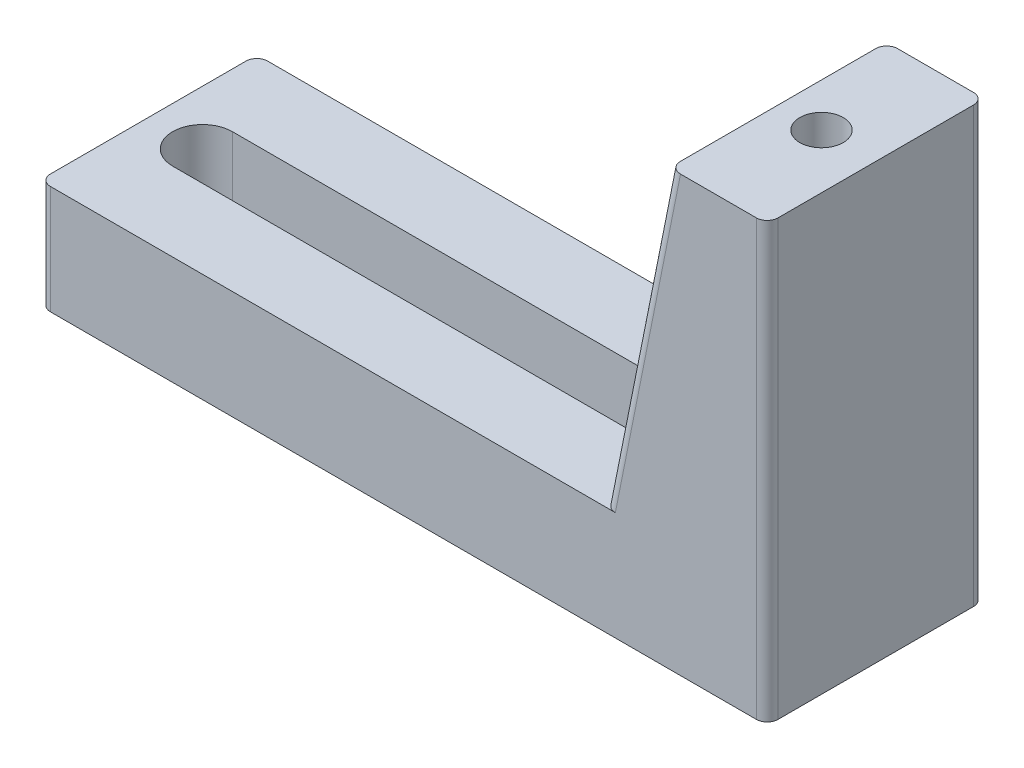
ISO-10303-21;
HEADER;
FILE_DESCRIPTION(('STEP AP214'),'2;1');
FILE_NAME('part.step','',(''),(''),'','','');
FILE_SCHEMA(('AUTOMOTIVE_DESIGN { 1 0 10303 214 1 1 1 1 }'));
ENDSEC;
DATA;
#1=APPLICATION_CONTEXT('core data for automotive mechanical design processes');
#2=APPLICATION_PROTOCOL_DEFINITION('international standard','automotive_design',2000,#1);
#3=PRODUCT_CONTEXT('',#1,'mechanical');
#4=PRODUCT('Part','Part','',(#3));
#5=PRODUCT_RELATED_PRODUCT_CATEGORY('part','',(#4));
#6=PRODUCT_DEFINITION_FORMATION('','',#4);
#7=PRODUCT_DEFINITION_CONTEXT('part definition',#1,'design');
#8=PRODUCT_DEFINITION('design','',#6,#7);
#9=PRODUCT_DEFINITION_SHAPE('','',#8);
#10=(LENGTH_UNIT() NAMED_UNIT(*) SI_UNIT(.MILLI.,.METRE.));
#11=(NAMED_UNIT(*) PLANE_ANGLE_UNIT() SI_UNIT($,.RADIAN.));
#12=(NAMED_UNIT(*) SI_UNIT($,.STERADIAN.) SOLID_ANGLE_UNIT());
#13=UNCERTAINTY_MEASURE_WITH_UNIT(LENGTH_MEASURE(1.E-05),#10,'distance_accuracy_value','');
#14=(GEOMETRIC_REPRESENTATION_CONTEXT(3) GLOBAL_UNCERTAINTY_ASSIGNED_CONTEXT((#13)) GLOBAL_UNIT_ASSIGNED_CONTEXT((#10,
#11,#12)) REPRESENTATION_CONTEXT('',''));
#15=CARTESIAN_POINT('',(0.,0.,0.));
#16=DIRECTION('',(0.,0.,1.));
#17=DIRECTION('',(1.,0.,0.));
#18=AXIS2_PLACEMENT_3D('',#15,#16,#17);
#19=CARTESIAN_POINT('',(55.,-10.,10.));
#20=DIRECTION('',(0.,1.,0.));
#21=DIRECTION('',(0.,0.,1.));
#22=AXIS2_PLACEMENT_3D('',#19,#20,#21);
#23=CYLINDRICAL_SURFACE('',#22,2.);
#24=CARTESIAN_POINT('',(55.,30.,10.));
#25=DIRECTION('',(0.,1.,0.));
#26=DIRECTION('',(0.,0.,1.));
#27=AXIS2_PLACEMENT_3D('',#24,#25,#26);
#28=CIRCLE('',#27,2.);
#29=CARTESIAN_POINT('',(55.,30.,12.));
#30=VERTEX_POINT('',#29);
#31=EDGE_CURVE('E186',#30,#30,#28,.T.);
#32=ORIENTED_EDGE('',*,*,#31,.T.);
#33=EDGE_LOOP('',(#32));
#34=FACE_BOUND('',#33,.T.);
#35=CARTESIAN_POINT('',(55.,25.,10.));
#36=DIRECTION('',(0.,-1.,0.));
#37=DIRECTION('',(1.,0.,0.));
#38=AXIS2_PLACEMENT_3D('',#35,#36,#37);
#39=CIRCLE('',#38,2.);
#40=CARTESIAN_POINT('',(57.,25.,10.));
#41=VERTEX_POINT('',#40);
#42=EDGE_CURVE('E221',#41,#41,#39,.F.);
#43=ORIENTED_EDGE('',*,*,#42,.F.);
#44=EDGE_LOOP('',(#43));
#45=FACE_BOUND('',#44,.T.);
#46=ADVANCED_FACE('F33',(#34,#45),#23,.F.);
#47=CARTESIAN_POINT('',(60.,-9.99999999999999,20.));
#48=DIRECTION('',(0.,1.,0.));
#49=DIRECTION('',(-1.,0.,0.));
#50=AXIS2_PLACEMENT_3D('',#47,#48,#49);
#51=PLANE('',#50);
#52=CARTESIAN_POINT('',(40.,-10.,10.));
#53=DIRECTION('',(0.,1.,0.));
#54=DIRECTION('',(0.,0.,1.));
#55=AXIS2_PLACEMENT_3D('',#52,#53,#54);
#56=CIRCLE('',#55,2.75);
#57=CARTESIAN_POINT('',(40.,-9.99999999999999,12.75));
#58=VERTEX_POINT('',#57);
#59=CARTESIAN_POINT('',(40.,-10.,7.25));
#60=VERTEX_POINT('',#59);
#61=EDGE_CURVE('E48',#58,#60,#56,.T.);
#62=ORIENTED_EDGE('',*,*,#61,.T.);
#63=DIRECTION('',(-1.,0.,0.));
#64=VECTOR('',#63,1.);
#65=CARTESIAN_POINT('',(-2.,-10.,7.25));
#66=LINE('',#65,#64);
#67=CARTESIAN_POINT('',(-2.,-10.,7.25));
#68=VERTEX_POINT('',#67);
#69=EDGE_CURVE('E160',#60,#68,#66,.T.);
#70=ORIENTED_EDGE('',*,*,#69,.T.);
#71=CARTESIAN_POINT('',(-2.,-10.,10.));
#72=DIRECTION('',(0.,1.,0.));
#73=DIRECTION('',(0.,0.,1.));
#74=AXIS2_PLACEMENT_3D('',#71,#72,#73);
#75=CIRCLE('',#74,2.75);
#76=CARTESIAN_POINT('',(-2.,-10.,12.75));
#77=VERTEX_POINT('',#76);
#78=EDGE_CURVE('E155',#68,#77,#75,.T.);
#79=ORIENTED_EDGE('',*,*,#78,.T.);
#80=DIRECTION('',(1.,0.,0.));
#81=VECTOR('',#80,1.);
#82=CARTESIAN_POINT('',(-2.,-10.,12.75));
#83=LINE('',#82,#81);
#84=EDGE_CURVE('E148',#77,#58,#83,.T.);
#85=ORIENTED_EDGE('',*,*,#84,.T.);
#86=EDGE_LOOP('',(#62,#70,#79,#85));
#87=FACE_BOUND('',#86,.T.);
#88=DIRECTION('',(1.,0.,0.));
#89=VECTOR('',#88,1.);
#90=CARTESIAN_POINT('',(60.,-9.99999999999999,0.));
#91=LINE('',#90,#89);
#92=CARTESIAN_POINT('',(-6.00000000000001,-10.,0.));
#93=VERTEX_POINT('',#92);
#94=CARTESIAN_POINT('',(59.,-9.99999999999999,0.));
#95=VERTEX_POINT('',#94);
#96=EDGE_CURVE('E191',#93,#95,#91,.T.);
#97=ORIENTED_EDGE('',*,*,#96,.T.);
#98=CARTESIAN_POINT('',(59.,-9.99999999999999,1.));
#99=DIRECTION('',(0.,1.,0.));
#100=DIRECTION('',(-1.,0.,0.));
#101=AXIS2_PLACEMENT_3D('',#98,#99,#100);
#102=CIRCLE('',#101,1.);
#103=CARTESIAN_POINT('',(60.,-9.99999999999999,1.));
#104=VERTEX_POINT('',#103);
#105=EDGE_CURVE('E263',#95,#104,#102,.F.);
#106=ORIENTED_EDGE('',*,*,#105,.T.);
#107=DIRECTION('',(0.,0.,-1.));
#108=VECTOR('',#107,1.);
#109=CARTESIAN_POINT('',(60.,-9.99999999999999,20.));
#110=LINE('',#109,#108);
#111=CARTESIAN_POINT('',(60.,-9.99999999999999,19.));
#112=VERTEX_POINT('',#111);
#113=EDGE_CURVE('E218',#112,#104,#110,.T.);
#114=ORIENTED_EDGE('',*,*,#113,.F.);
#115=CARTESIAN_POINT('',(59.,-9.99999999999999,19.));
#116=DIRECTION('',(0.,1.,0.));
#117=DIRECTION('',(-1.,0.,0.));
#118=AXIS2_PLACEMENT_3D('',#115,#116,#117);
#119=CIRCLE('',#118,1.);
#120=CARTESIAN_POINT('',(59.,-9.99999999999999,20.));
#121=VERTEX_POINT('',#120);
#122=EDGE_CURVE('E261',#112,#121,#119,.F.);
#123=ORIENTED_EDGE('',*,*,#122,.T.);
#124=DIRECTION('',(1.,0.,0.));
#125=VECTOR('',#124,1.);
#126=CARTESIAN_POINT('',(60.,-9.99999999999999,20.));
#127=LINE('',#126,#125);
#128=CARTESIAN_POINT('',(-6.00000000000001,-10.,20.));
#129=VERTEX_POINT('',#128);
#130=EDGE_CURVE('E192',#129,#121,#127,.T.);
#131=ORIENTED_EDGE('',*,*,#130,.F.);
#132=CARTESIAN_POINT('',(-6.,-10.,19.));
#133=DIRECTION('',(0.,1.,0.));
#134=DIRECTION('',(-1.,0.,0.));
#135=AXIS2_PLACEMENT_3D('',#132,#133,#134);
#136=CIRCLE('',#135,1.);
#137=CARTESIAN_POINT('',(-7.,-10.,19.));
#138=VERTEX_POINT('',#137);
#139=EDGE_CURVE('E259',#129,#138,#136,.F.);
#140=ORIENTED_EDGE('',*,*,#139,.T.);
#141=DIRECTION('',(0.,0.,-1.));
#142=VECTOR('',#141,1.);
#143=CARTESIAN_POINT('',(-7.,-10.,0.));
#144=LINE('',#143,#142);
#145=CARTESIAN_POINT('',(-7.,-10.,1.));
#146=VERTEX_POINT('',#145);
#147=EDGE_CURVE('E183',#138,#146,#144,.T.);
#148=ORIENTED_EDGE('',*,*,#147,.T.);
#149=CARTESIAN_POINT('',(-6.,-10.,1.));
#150=DIRECTION('',(0.,1.,0.));
#151=DIRECTION('',(-1.,0.,0.));
#152=AXIS2_PLACEMENT_3D('',#149,#150,#151);
#153=CIRCLE('',#152,1.);
#154=EDGE_CURVE('E257',#146,#93,#153,.F.);
#155=ORIENTED_EDGE('',*,*,#154,.T.);
#156=EDGE_LOOP('',(#97,#106,#114,#123,#131,#140,#148,#155));
#157=FACE_BOUND('',#156,.T.);
#158=ADVANCED_FACE('F162',(#87,#157),#51,.F.);
#159=CARTESIAN_POINT('',(60.,30.,20.));
#160=DIRECTION('',(-1.,0.,0.));
#161=DIRECTION('',(0.,-1.,0.));
#162=AXIS2_PLACEMENT_3D('',#159,#160,#161);
#163=PLANE('',#162);
#164=ORIENTED_EDGE('',*,*,#113,.T.);
#165=DIRECTION('',(0.,1.,0.));
#166=VECTOR('',#165,1.);
#167=CARTESIAN_POINT('',(60.,30.,1.));
#168=LINE('',#167,#166);
#169=CARTESIAN_POINT('',(60.,30.,1.));
#170=VERTEX_POINT('',#169);
#171=EDGE_CURVE('E254',#104,#170,#168,.T.);
#172=ORIENTED_EDGE('',*,*,#171,.T.);
#173=DIRECTION('',(0.,0.,-1.));
#174=VECTOR('',#173,1.);
#175=CARTESIAN_POINT('',(60.,30.,20.));
#176=LINE('',#175,#174);
#177=CARTESIAN_POINT('',(60.,30.,19.));
#178=VERTEX_POINT('',#177);
#179=EDGE_CURVE('E215',#178,#170,#176,.T.);
#180=ORIENTED_EDGE('',*,*,#179,.F.);
#181=DIRECTION('',(0.,1.,0.));
#182=VECTOR('',#181,1.);
#183=CARTESIAN_POINT('',(60.,30.,19.));
#184=LINE('',#183,#182);
#185=EDGE_CURVE('E252',#178,#112,#184,.F.);
#186=ORIENTED_EDGE('',*,*,#185,.T.);
#187=EDGE_LOOP('',(#164,#172,#180,#186));
#188=FACE_BOUND('',#187,.T.);
#189=ADVANCED_FACE('F295',(#188),#163,.F.);
#190=CARTESIAN_POINT('',(51.,30.,20.));
#191=DIRECTION('',(0.,-1.,0.));
#192=DIRECTION('',(1.,0.,0.));
#193=AXIS2_PLACEMENT_3D('',#190,#191,#192);
#194=PLANE('',#193);
#195=ORIENTED_EDGE('',*,*,#31,.F.);
#196=EDGE_LOOP('',(#195));
#197=FACE_BOUND('',#196,.T.);
#198=DIRECTION('',(-1.,0.,0.));
#199=VECTOR('',#198,1.);
#200=CARTESIAN_POINT('',(51.,30.,0.));
#201=LINE('',#200,#199);
#202=CARTESIAN_POINT('',(59.,30.,0.));
#203=VERTEX_POINT('',#202);
#204=CARTESIAN_POINT('',(52.0198039027186,30.,0.));
#205=VERTEX_POINT('',#204);
#206=EDGE_CURVE('E205',#203,#205,#201,.T.);
#207=ORIENTED_EDGE('',*,*,#206,.T.);
#208=CARTESIAN_POINT('',(52.0198039027186,30.,1.));
#209=DIRECTION('',(0.,-1.,0.));
#210=DIRECTION('',(1.,0.,0.));
#211=AXIS2_PLACEMENT_3D('',#208,#209,#210);
#212=ELLIPSE('',#211,1.01980390271856,1.);
#213=CARTESIAN_POINT('',(51.,30.,1.));
#214=VERTEX_POINT('',#213);
#215=EDGE_CURVE('E242',#205,#214,#212,.F.);
#216=ORIENTED_EDGE('',*,*,#215,.T.);
#217=DIRECTION('',(0.,0.,-1.));
#218=VECTOR('',#217,1.);
#219=CARTESIAN_POINT('',(51.,30.,20.));
#220=LINE('',#219,#218);
#221=CARTESIAN_POINT('',(51.,30.,19.));
#222=VERTEX_POINT('',#221);
#223=EDGE_CURVE('E212',#222,#214,#220,.T.);
#224=ORIENTED_EDGE('',*,*,#223,.F.);
#225=CARTESIAN_POINT('',(52.0198039027185,30.,19.));
#226=DIRECTION('',(0.,-1.,0.));
#227=DIRECTION('',(-1.,0.,0.));
#228=AXIS2_PLACEMENT_3D('',#225,#226,#227);
#229=ELLIPSE('',#228,1.01980390271856,1.);
#230=CARTESIAN_POINT('',(52.0198039027185,30.,20.));
#231=VERTEX_POINT('',#230);
#232=EDGE_CURVE('E240',#222,#231,#229,.F.);
#233=ORIENTED_EDGE('',*,*,#232,.T.);
#234=DIRECTION('',(-1.,0.,0.));
#235=VECTOR('',#234,1.);
#236=CARTESIAN_POINT('',(51.,30.,20.));
#237=LINE('',#236,#235);
#238=CARTESIAN_POINT('',(59.,30.,20.));
#239=VERTEX_POINT('',#238);
#240=EDGE_CURVE('E195',#239,#231,#237,.T.);
#241=ORIENTED_EDGE('',*,*,#240,.F.);
#242=CARTESIAN_POINT('',(59.,30.,19.));
#243=DIRECTION('',(0.,-1.,0.));
#244=DIRECTION('',(1.,0.,0.));
#245=AXIS2_PLACEMENT_3D('',#242,#243,#244);
#246=CIRCLE('',#245,1.);
#247=EDGE_CURVE('E236',#239,#178,#246,.F.);
#248=ORIENTED_EDGE('',*,*,#247,.T.);
#249=ORIENTED_EDGE('',*,*,#179,.T.);
#250=CARTESIAN_POINT('',(59.,30.,1.));
#251=DIRECTION('',(0.,-1.,0.));
#252=DIRECTION('',(1.,0.,0.));
#253=AXIS2_PLACEMENT_3D('',#250,#251,#252);
#254=CIRCLE('',#253,1.);
#255=EDGE_CURVE('E238',#170,#203,#254,.F.);
#256=ORIENTED_EDGE('',*,*,#255,.T.);
#257=EDGE_LOOP('',(#207,#216,#224,#233,#241,#248,#249,#256));
#258=FACE_BOUND('',#257,.T.);
#259=ADVANCED_FACE('F287',(#197,#258),#194,.F.);
#260=CARTESIAN_POINT('',(45.,0.,20.));
#261=DIRECTION('',(0.98058067569092,-0.196116135138184,0.));
#262=DIRECTION('',(0.196116135138184,0.98058067569092,0.));
#263=AXIS2_PLACEMENT_3D('',#260,#261,#262);
#264=PLANE('',#263);
#265=ORIENTED_EDGE('',*,*,#223,.T.);
#266=DIRECTION('',(-0.196116135138184,-0.98058067569092,0.));
#267=VECTOR('',#266,1.);
#268=CARTESIAN_POINT('',(45.,0.,1.));
#269=LINE('',#268,#267);
#270=CARTESIAN_POINT('',(45.,0.,1.));
#271=VERTEX_POINT('',#270);
#272=EDGE_CURVE('E226',#214,#271,#269,.T.);
#273=ORIENTED_EDGE('',*,*,#272,.T.);
#274=DIRECTION('',(0.,0.,-1.));
#275=VECTOR('',#274,1.);
#276=CARTESIAN_POINT('',(45.,0.,20.));
#277=LINE('',#276,#275);
#278=CARTESIAN_POINT('',(45.,0.,19.));
#279=VERTEX_POINT('',#278);
#280=EDGE_CURVE('E202',#279,#271,#277,.T.);
#281=ORIENTED_EDGE('',*,*,#280,.F.);
#282=DIRECTION('',(-0.196116135138184,-0.98058067569092,0.));
#283=VECTOR('',#282,1.);
#284=CARTESIAN_POINT('',(45.,0.,19.));
#285=LINE('',#284,#283);
#286=EDGE_CURVE('E224',#279,#222,#285,.F.);
#287=ORIENTED_EDGE('',*,*,#286,.T.);
#288=EDGE_LOOP('',(#265,#273,#281,#287));
#289=FACE_BOUND('',#288,.T.);
#290=ADVANCED_FACE('F352',(#289),#264,.F.);
#291=CARTESIAN_POINT('',(0.,0.,20.));
#292=DIRECTION('',(0.,-1.,0.));
#293=DIRECTION('',(0.,0.,-1.));
#294=AXIS2_PLACEMENT_3D('',#291,#292,#293);
#295=PLANE('',#294);
#296=DIRECTION('',(1.,0.,0.));
#297=VECTOR('',#296,1.);
#298=CARTESIAN_POINT('',(-2.,0.,12.75));
#299=LINE('',#298,#297);
#300=CARTESIAN_POINT('',(-2.,0.,12.75));
#301=VERTEX_POINT('',#300);
#302=CARTESIAN_POINT('',(40.,0.,12.75));
#303=VERTEX_POINT('',#302);
#304=EDGE_CURVE('E172',#301,#303,#299,.T.);
#305=ORIENTED_EDGE('',*,*,#304,.F.);
#306=CARTESIAN_POINT('',(-2.,0.,10.));
#307=DIRECTION('',(0.,1.,0.));
#308=DIRECTION('',(0.,0.,1.));
#309=AXIS2_PLACEMENT_3D('',#306,#307,#308);
#310=CIRCLE('',#309,2.75);
#311=CARTESIAN_POINT('',(-2.,0.,7.25));
#312=VERTEX_POINT('',#311);
#313=EDGE_CURVE('E56',#312,#301,#310,.T.);
#314=ORIENTED_EDGE('',*,*,#313,.F.);
#315=DIRECTION('',(-1.,0.,0.));
#316=VECTOR('',#315,1.);
#317=CARTESIAN_POINT('',(-2.,0.,7.25));
#318=LINE('',#317,#316);
#319=CARTESIAN_POINT('',(40.,0.,7.25));
#320=VERTEX_POINT('',#319);
#321=EDGE_CURVE('E164',#320,#312,#318,.T.);
#322=ORIENTED_EDGE('',*,*,#321,.F.);
#323=CARTESIAN_POINT('',(40.,0.,10.));
#324=DIRECTION('',(0.,1.,0.));
#325=DIRECTION('',(0.,0.,1.));
#326=AXIS2_PLACEMENT_3D('',#323,#324,#325);
#327=CIRCLE('',#326,2.75);
#328=EDGE_CURVE('E166',#303,#320,#327,.T.);
#329=ORIENTED_EDGE('',*,*,#328,.F.);
#330=EDGE_LOOP('',(#305,#314,#322,#329));
#331=FACE_BOUND('',#330,.T.);
#332=DIRECTION('',(0.,0.,1.));
#333=VECTOR('',#332,1.);
#334=CARTESIAN_POINT('',(-7.,0.,0.));
#335=LINE('',#334,#333);
#336=CARTESIAN_POINT('',(-7.,0.,1.));
#337=VERTEX_POINT('',#336);
#338=CARTESIAN_POINT('',(-7.,0.,19.));
#339=VERTEX_POINT('',#338);
#340=EDGE_CURVE('E178',#337,#339,#335,.T.);
#341=ORIENTED_EDGE('',*,*,#340,.T.);
#342=CARTESIAN_POINT('',(-6.,0.,19.));
#343=DIRECTION('',(0.,-1.,0.));
#344=DIRECTION('',(0.,0.,-1.));
#345=AXIS2_PLACEMENT_3D('',#342,#343,#344);
#346=CIRCLE('',#345,1.);
#347=CARTESIAN_POINT('',(-6.,0.,20.));
#348=VERTEX_POINT('',#347);
#349=EDGE_CURVE('E272',#339,#348,#346,.F.);
#350=ORIENTED_EDGE('',*,*,#349,.T.);
#351=DIRECTION('',(-1.,0.,0.));
#352=VECTOR('',#351,1.);
#353=CARTESIAN_POINT('',(0.,0.,20.));
#354=LINE('',#353,#352);
#355=CARTESIAN_POINT('',(46.0198039027185,0.,20.));
#356=VERTEX_POINT('',#355);
#357=EDGE_CURVE('E199',#356,#348,#354,.T.);
#358=ORIENTED_EDGE('',*,*,#357,.F.);
#359=CARTESIAN_POINT('',(46.0198039027186,0.,19.));
#360=DIRECTION('',(0.,-1.,0.));
#361=DIRECTION('',(-1.,0.,0.));
#362=AXIS2_PLACEMENT_3D('',#359,#360,#361);
#363=ELLIPSE('',#362,1.01980390271856,1.);
#364=EDGE_CURVE('E11',#356,#279,#363,.T.);
#365=ORIENTED_EDGE('',*,*,#364,.T.);
#366=ORIENTED_EDGE('',*,*,#280,.T.);
#367=CARTESIAN_POINT('',(46.0198039027186,0.,1.));
#368=DIRECTION('',(0.,-1.,0.));
#369=DIRECTION('',(1.,0.,0.));
#370=AXIS2_PLACEMENT_3D('',#367,#368,#369);
#371=ELLIPSE('',#370,1.01980390271856,1.);
#372=CARTESIAN_POINT('',(46.0198039027186,0.,0.));
#373=VERTEX_POINT('',#372);
#374=EDGE_CURVE('E41',#271,#373,#371,.T.);
#375=ORIENTED_EDGE('',*,*,#374,.T.);
#376=DIRECTION('',(-1.,0.,0.));
#377=VECTOR('',#376,1.);
#378=CARTESIAN_POINT('',(0.,0.,0.));
#379=LINE('',#378,#377);
#380=CARTESIAN_POINT('',(-6.,0.,0.));
#381=VERTEX_POINT('',#380);
#382=EDGE_CURVE('E196',#373,#381,#379,.T.);
#383=ORIENTED_EDGE('',*,*,#382,.T.);
#384=CARTESIAN_POINT('',(-6.,0.,1.));
#385=DIRECTION('',(0.,-1.,0.));
#386=DIRECTION('',(0.,0.,-1.));
#387=AXIS2_PLACEMENT_3D('',#384,#385,#386);
#388=CIRCLE('',#387,1.);
#389=EDGE_CURVE('E270',#381,#337,#388,.F.);
#390=ORIENTED_EDGE('',*,*,#389,.T.);
#391=EDGE_LOOP('',(#341,#350,#358,#365,#366,#375,#383,#390));
#392=FACE_BOUND('',#391,.T.);
#393=ADVANCED_FACE('F276',(#331,#392),#295,.F.);
#394=CARTESIAN_POINT('',(0.,0.,20.));
#395=DIRECTION('',(0.,0.,-1.));
#396=DIRECTION('',(-1.,0.,0.));
#397=AXIS2_PLACEMENT_3D('',#394,#395,#396);
#398=PLANE('',#397);
#399=ORIENTED_EDGE('',*,*,#240,.T.);
#400=DIRECTION('',(-0.196116135138184,-0.98058067569092,0.));
#401=VECTOR('',#400,1.);
#402=CARTESIAN_POINT('',(44.2498114449217,-8.84996228898432,20.));
#403=LINE('',#402,#401);
#404=EDGE_CURVE('E249',#231,#356,#403,.T.);
#405=ORIENTED_EDGE('',*,*,#404,.T.);
#406=ORIENTED_EDGE('',*,*,#357,.T.);
#407=DIRECTION('',(0.,1.,0.));
#408=VECTOR('',#407,1.);
#409=CARTESIAN_POINT('',(-6.,-10.,20.));
#410=LINE('',#409,#408);
#411=EDGE_CURVE('E244',#348,#129,#410,.F.);
#412=ORIENTED_EDGE('',*,*,#411,.T.);
#413=ORIENTED_EDGE('',*,*,#130,.T.);
#414=DIRECTION('',(0.,1.,0.));
#415=VECTOR('',#414,1.);
#416=CARTESIAN_POINT('',(59.,0.,20.));
#417=LINE('',#416,#415);
#418=EDGE_CURVE('E246',#121,#239,#417,.T.);
#419=ORIENTED_EDGE('',*,*,#418,.T.);
#420=EDGE_LOOP('',(#399,#405,#406,#412,#413,#419));
#421=FACE_BOUND('',#420,.T.);
#422=ADVANCED_FACE('F305',(#421),#398,.F.);
#423=CARTESIAN_POINT('',(0.,0.,0.));
#424=DIRECTION('',(0.,0.,-1.));
#425=DIRECTION('',(-1.,0.,0.));
#426=AXIS2_PLACEMENT_3D('',#423,#424,#425);
#427=PLANE('',#426);
#428=ORIENTED_EDGE('',*,*,#382,.F.);
#429=DIRECTION('',(-0.196116135138184,-0.98058067569092,0.));
#430=VECTOR('',#429,1.);
#431=CARTESIAN_POINT('',(51.9805806756909,29.8038838648618,0.));
#432=LINE('',#431,#430);
#433=EDGE_CURVE('E234',#373,#205,#432,.F.);
#434=ORIENTED_EDGE('',*,*,#433,.T.);
#435=ORIENTED_EDGE('',*,*,#206,.F.);
#436=DIRECTION('',(0.,1.,0.));
#437=VECTOR('',#436,1.);
#438=CARTESIAN_POINT('',(59.,-9.99999999999999,0.));
#439=LINE('',#438,#437);
#440=EDGE_CURVE('E232',#203,#95,#439,.F.);
#441=ORIENTED_EDGE('',*,*,#440,.T.);
#442=ORIENTED_EDGE('',*,*,#96,.F.);
#443=DIRECTION('',(0.,1.,0.));
#444=VECTOR('',#443,1.);
#445=CARTESIAN_POINT('',(-6.,0.,0.));
#446=LINE('',#445,#444);
#447=EDGE_CURVE('E229',#93,#381,#446,.T.);
#448=ORIENTED_EDGE('',*,*,#447,.T.);
#449=EDGE_LOOP('',(#428,#434,#435,#441,#442,#448));
#450=FACE_BOUND('',#449,.T.);
#451=ADVANCED_FACE('F284',(#450),#427,.T.);
#452=CARTESIAN_POINT('',(55.,25.,10.));
#453=DIRECTION('',(0.,-1.,0.));
#454=DIRECTION('',(1.,0.,0.));
#455=AXIS2_PLACEMENT_3D('',#452,#453,#454);
#456=PLANE('',#455);
#457=ORIENTED_EDGE('',*,*,#42,.T.);
#458=EDGE_LOOP('',(#457));
#459=FACE_BOUND('',#458,.T.);
#460=ADVANCED_FACE('F344',(#459),#456,.F.);
#461=CARTESIAN_POINT('',(-7.,-31.1896201004171,0.));
#462=DIRECTION('',(-1.,0.,0.));
#463=DIRECTION('',(0.,0.,1.));
#464=AXIS2_PLACEMENT_3D('',#461,#462,#463);
#465=PLANE('',#464);
#466=ORIENTED_EDGE('',*,*,#147,.F.);
#467=DIRECTION('',(0.,1.,0.));
#468=VECTOR('',#467,1.);
#469=CARTESIAN_POINT('',(-7.,0.,19.));
#470=LINE('',#469,#468);
#471=EDGE_CURVE('E267',#138,#339,#470,.T.);
#472=ORIENTED_EDGE('',*,*,#471,.T.);
#473=ORIENTED_EDGE('',*,*,#340,.F.);
#474=DIRECTION('',(0.,1.,0.));
#475=VECTOR('',#474,1.);
#476=CARTESIAN_POINT('',(-7.,-31.1896201004171,1.));
#477=LINE('',#476,#475);
#478=EDGE_CURVE('E265',#337,#146,#477,.F.);
#479=ORIENTED_EDGE('',*,*,#478,.T.);
#480=EDGE_LOOP('',(#466,#472,#473,#479));
#481=FACE_BOUND('',#480,.T.);
#482=ADVANCED_FACE('F320',(#481),#465,.T.);
#483=CARTESIAN_POINT('',(45.9805806756909,-0.196116135138184,1.));
#484=DIRECTION('',(0.196116135138184,0.98058067569092,0.));
#485=DIRECTION('',(-0.98058067569092,0.196116135138184,0.));
#486=AXIS2_PLACEMENT_3D('',#483,#484,#485);
#487=CYLINDRICAL_SURFACE('',#486,1.);
#488=ORIENTED_EDGE('',*,*,#215,.F.);
#489=ORIENTED_EDGE('',*,*,#433,.F.);
#490=ORIENTED_EDGE('',*,*,#374,.F.);
#491=ORIENTED_EDGE('',*,*,#272,.F.);
#492=EDGE_LOOP('',(#488,#489,#490,#491));
#493=FACE_BOUND('',#492,.T.);
#494=ADVANCED_FACE('F281',(#493),#487,.T.);
#495=CARTESIAN_POINT('',(44.2498114449217,-8.84996228898432,19.));
#496=DIRECTION('',(-0.196116135138184,-0.98058067569092,0.));
#497=DIRECTION('',(0.98058067569092,-0.196116135138184,0.));
#498=AXIS2_PLACEMENT_3D('',#495,#496,#497);
#499=CYLINDRICAL_SURFACE('',#498,1.);
#500=ORIENTED_EDGE('',*,*,#232,.F.);
#501=ORIENTED_EDGE('',*,*,#286,.F.);
#502=ORIENTED_EDGE('',*,*,#364,.F.);
#503=ORIENTED_EDGE('',*,*,#404,.F.);
#504=EDGE_LOOP('',(#500,#501,#502,#503));
#505=FACE_BOUND('',#504,.T.);
#506=ADVANCED_FACE('F310',(#505),#499,.T.);
#507=CARTESIAN_POINT('',(59.,30.,1.));
#508=DIRECTION('',(0.,-1.,0.));
#509=DIRECTION('',(1.,0.,0.));
#510=AXIS2_PLACEMENT_3D('',#507,#508,#509);
#511=CYLINDRICAL_SURFACE('',#510,1.);
#512=ORIENTED_EDGE('',*,*,#105,.F.);
#513=ORIENTED_EDGE('',*,*,#440,.F.);
#514=ORIENTED_EDGE('',*,*,#255,.F.);
#515=ORIENTED_EDGE('',*,*,#171,.F.);
#516=EDGE_LOOP('',(#512,#513,#514,#515));
#517=FACE_BOUND('',#516,.T.);
#518=ADVANCED_FACE('F293',(#517),#511,.T.);
#519=CARTESIAN_POINT('',(59.,0.,19.));
#520=DIRECTION('',(0.,1.,0.));
#521=DIRECTION('',(-1.,0.,0.));
#522=AXIS2_PLACEMENT_3D('',#519,#520,#521);
#523=CYLINDRICAL_SURFACE('',#522,1.);
#524=ORIENTED_EDGE('',*,*,#122,.F.);
#525=ORIENTED_EDGE('',*,*,#185,.F.);
#526=ORIENTED_EDGE('',*,*,#247,.F.);
#527=ORIENTED_EDGE('',*,*,#418,.F.);
#528=EDGE_LOOP('',(#524,#525,#526,#527));
#529=FACE_BOUND('',#528,.T.);
#530=ADVANCED_FACE('F302',(#529),#523,.T.);
#531=CARTESIAN_POINT('',(-6.,-31.1896201004171,19.));
#532=DIRECTION('',(0.,-1.,0.));
#533=DIRECTION('',(0.,0.,-1.));
#534=AXIS2_PLACEMENT_3D('',#531,#532,#533);
#535=CYLINDRICAL_SURFACE('',#534,1.);
#536=ORIENTED_EDGE('',*,*,#139,.F.);
#537=ORIENTED_EDGE('',*,*,#411,.F.);
#538=ORIENTED_EDGE('',*,*,#349,.F.);
#539=ORIENTED_EDGE('',*,*,#471,.F.);
#540=EDGE_LOOP('',(#536,#537,#538,#539));
#541=FACE_BOUND('',#540,.T.);
#542=ADVANCED_FACE('F315',(#541),#535,.T.);
#543=CARTESIAN_POINT('',(-6.,0.,1.));
#544=DIRECTION('',(0.,1.,0.));
#545=DIRECTION('',(0.,0.,1.));
#546=AXIS2_PLACEMENT_3D('',#543,#544,#545);
#547=CYLINDRICAL_SURFACE('',#546,1.);
#548=ORIENTED_EDGE('',*,*,#154,.F.);
#549=ORIENTED_EDGE('',*,*,#478,.F.);
#550=ORIENTED_EDGE('',*,*,#389,.F.);
#551=ORIENTED_EDGE('',*,*,#447,.F.);
#552=EDGE_LOOP('',(#548,#549,#550,#551));
#553=FACE_BOUND('',#552,.T.);
#554=ADVANCED_FACE('F35',(#553),#547,.T.);
#555=CARTESIAN_POINT('',(-2.,-10.,7.25));
#556=DIRECTION('',(0.,0.,-1.));
#557=DIRECTION('',(-1.,0.,0.));
#558=AXIS2_PLACEMENT_3D('',#555,#556,#557);
#559=PLANE('',#558);
#560=ORIENTED_EDGE('',*,*,#321,.T.);
#561=DIRECTION('',(0.,1.,0.));
#562=VECTOR('',#561,1.);
#563=CARTESIAN_POINT('',(-2.,-10.,7.25));
#564=LINE('',#563,#562);
#565=EDGE_CURVE('E176',#68,#312,#564,.T.);
#566=ORIENTED_EDGE('',*,*,#565,.F.);
#567=ORIENTED_EDGE('',*,*,#69,.F.);
#568=DIRECTION('',(0.,1.,0.));
#569=VECTOR('',#568,1.);
#570=CARTESIAN_POINT('',(40.,-10.,7.25));
#571=LINE('',#570,#569);
#572=EDGE_CURVE('E179',#60,#320,#571,.T.);
#573=ORIENTED_EDGE('',*,*,#572,.T.);
#574=EDGE_LOOP('',(#560,#566,#567,#573));
#575=FACE_BOUND('',#574,.T.);
#576=ADVANCED_FACE('F327',(#575),#559,.F.);
#577=CARTESIAN_POINT('',(-2.,-10.,12.75));
#578=DIRECTION('',(0.,0.,1.));
#579=DIRECTION('',(1.,0.,0.));
#580=AXIS2_PLACEMENT_3D('',#577,#578,#579);
#581=PLANE('',#580);
#582=ORIENTED_EDGE('',*,*,#304,.T.);
#583=DIRECTION('',(0.,1.,0.));
#584=VECTOR('',#583,1.);
#585=CARTESIAN_POINT('',(40.,-10.,12.75));
#586=LINE('',#585,#584);
#587=EDGE_CURVE('E152',#58,#303,#586,.T.);
#588=ORIENTED_EDGE('',*,*,#587,.F.);
#589=ORIENTED_EDGE('',*,*,#84,.F.);
#590=DIRECTION('',(0.,1.,0.));
#591=VECTOR('',#590,1.);
#592=CARTESIAN_POINT('',(-2.,-10.,12.75));
#593=LINE('',#592,#591);
#594=EDGE_CURVE('E150',#77,#301,#593,.T.);
#595=ORIENTED_EDGE('',*,*,#594,.T.);
#596=EDGE_LOOP('',(#582,#588,#589,#595));
#597=FACE_BOUND('',#596,.T.);
#598=ADVANCED_FACE('F149',(#597),#581,.F.);
#599=CARTESIAN_POINT('',(-2.,-10.,10.));
#600=DIRECTION('',(0.,1.,0.));
#601=DIRECTION('',(0.,0.,1.));
#602=AXIS2_PLACEMENT_3D('',#599,#600,#601);
#603=CYLINDRICAL_SURFACE('',#602,2.75);
#604=ORIENTED_EDGE('',*,*,#313,.T.);
#605=ORIENTED_EDGE('',*,*,#594,.F.);
#606=ORIENTED_EDGE('',*,*,#78,.F.);
#607=ORIENTED_EDGE('',*,*,#565,.T.);
#608=EDGE_LOOP('',(#604,#605,#606,#607));
#609=FACE_BOUND('',#608,.T.);
#610=ADVANCED_FACE('F158',(#609),#603,.F.);
#611=CARTESIAN_POINT('',(40.,-10.,10.));
#612=DIRECTION('',(0.,1.,0.));
#613=DIRECTION('',(0.,0.,1.));
#614=AXIS2_PLACEMENT_3D('',#611,#612,#613);
#615=CYLINDRICAL_SURFACE('',#614,2.75);
#616=ORIENTED_EDGE('',*,*,#328,.T.);
#617=ORIENTED_EDGE('',*,*,#572,.F.);
#618=ORIENTED_EDGE('',*,*,#61,.F.);
#619=ORIENTED_EDGE('',*,*,#587,.T.);
#620=EDGE_LOOP('',(#616,#617,#618,#619));
#621=FACE_BOUND('',#620,.T.);
#622=ADVANCED_FACE('F420',(#621),#615,.F.);
#623=CLOSED_SHELL('',(#46,#158,#189,#259,#290,#393,#422,#451,#460,#482,#494,#506,#518,#530,#542,
#554,#576,#598,#610,#622));
#624=MANIFOLD_SOLID_BREP('B2',#623);
#625=ADVANCED_BREP_SHAPE_REPRESENTATION('',(#18,#624),#14);
#626=SHAPE_DEFINITION_REPRESENTATION(#9,#625);
ENDSEC;
END-ISO-10303-21;
